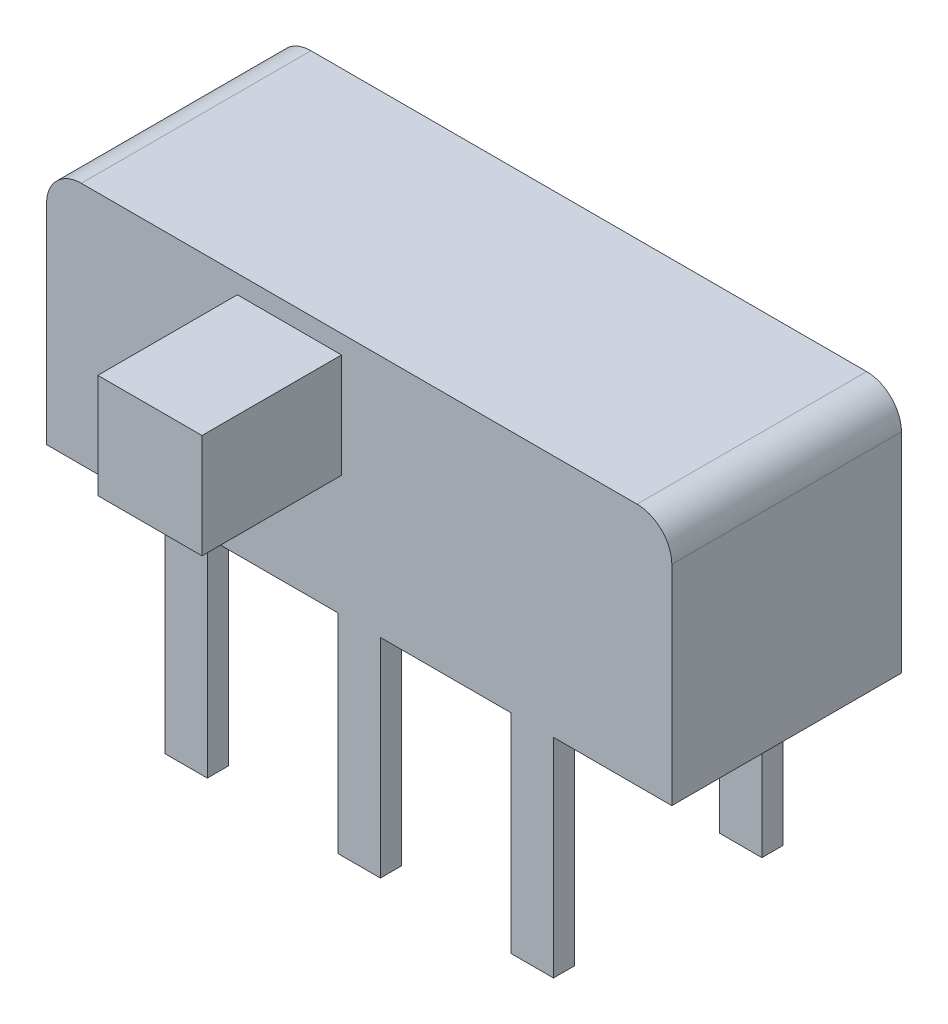
ISO-10303-21;
HEADER;
FILE_DESCRIPTION(('STEP AP214'),'2;1');
FILE_NAME('part.step','',(''),(''),'','','');
FILE_SCHEMA(('AUTOMOTIVE_DESIGN { 1 0 10303 214 1 1 1 1 }'));
ENDSEC;
DATA;
#1=APPLICATION_CONTEXT('core data for automotive mechanical design processes');
#2=APPLICATION_PROTOCOL_DEFINITION('international standard','automotive_design',2000,#1);
#3=PRODUCT_CONTEXT('',#1,'mechanical');
#4=PRODUCT('Part','Part','',(#3));
#5=PRODUCT_RELATED_PRODUCT_CATEGORY('part','',(#4));
#6=PRODUCT_DEFINITION_FORMATION('','',#4);
#7=PRODUCT_DEFINITION_CONTEXT('part definition',#1,'design');
#8=PRODUCT_DEFINITION('design','',#6,#7);
#9=PRODUCT_DEFINITION_SHAPE('','',#8);
#10=(LENGTH_UNIT() NAMED_UNIT(*) SI_UNIT(.MILLI.,.METRE.));
#11=(NAMED_UNIT(*) PLANE_ANGLE_UNIT() SI_UNIT($,.RADIAN.));
#12=(NAMED_UNIT(*) SI_UNIT($,.STERADIAN.) SOLID_ANGLE_UNIT());
#13=UNCERTAINTY_MEASURE_WITH_UNIT(LENGTH_MEASURE(1.E-05),#10,'distance_accuracy_value','');
#14=(GEOMETRIC_REPRESENTATION_CONTEXT(3) GLOBAL_UNCERTAINTY_ASSIGNED_CONTEXT((#13)) GLOBAL_UNIT_ASSIGNED_CONTEXT((#10,
#11,#12)) REPRESENTATION_CONTEXT('',''));
#15=CARTESIAN_POINT('',(0.,0.,0.));
#16=DIRECTION('',(0.,0.,1.));
#17=DIRECTION('',(1.,0.,0.));
#18=AXIS2_PLACEMENT_3D('',#15,#16,#17);
#19=CARTESIAN_POINT('',(-4.4958,0.,-1.65099999999999));
#20=DIRECTION('',(0.,-1.,0.));
#21=DIRECTION('',(0.,0.,-1.));
#22=AXIS2_PLACEMENT_3D('',#19,#20,#21);
#23=PLANE('',#22);
#24=DIRECTION('',(0.,0.,1.));
#25=VECTOR('',#24,1.);
#26=CARTESIAN_POINT('',(-2.794,0.,-1.65099999999999));
#27=LINE('',#26,#25);
#28=CARTESIAN_POINT('',(-2.794,0.,-1.65099999999999));
#29=VERTEX_POINT('',#28);
#30=CARTESIAN_POINT('',(-2.794,0.,-1.34619999999999));
#31=VERTEX_POINT('',#30);
#32=EDGE_CURVE('E50',#29,#31,#27,.T.);
#33=ORIENTED_EDGE('',*,*,#32,.T.);
#34=DIRECTION('',(1.,0.,0.));
#35=VECTOR('',#34,1.);
#36=CARTESIAN_POINT('',(-2.794,0.,-1.34619999999999));
#37=LINE('',#36,#35);
#38=CARTESIAN_POINT('',(-2.1844,0.,-1.34619999999999));
#39=VERTEX_POINT('',#38);
#40=EDGE_CURVE('E271',#31,#39,#37,.T.);
#41=ORIENTED_EDGE('',*,*,#40,.T.);
#42=DIRECTION('',(0.,0.,-1.));
#43=VECTOR('',#42,1.);
#44=CARTESIAN_POINT('',(-2.1844,0.,-1.65099999999999));
#45=LINE('',#44,#43);
#46=CARTESIAN_POINT('',(-2.1844,0.,-1.65099999999999));
#47=VERTEX_POINT('',#46);
#48=EDGE_CURVE('E283',#39,#47,#45,.T.);
#49=ORIENTED_EDGE('',*,*,#48,.T.);
#50=DIRECTION('',(-1.,0.,0.));
#51=VECTOR('',#50,1.);
#52=CARTESIAN_POINT('',(-4.4958,0.,-1.65099999999999));
#53=LINE('',#52,#51);
#54=CARTESIAN_POINT('',(-0.304800000000001,0.,-1.651));
#55=VERTEX_POINT('',#54);
#56=EDGE_CURVE('E483',#55,#47,#53,.T.);
#57=ORIENTED_EDGE('',*,*,#56,.F.);
#58=DIRECTION('',(0.,0.,1.));
#59=VECTOR('',#58,1.);
#60=CARTESIAN_POINT('',(-0.3048,0.,-1.651));
#61=LINE('',#60,#59);
#62=CARTESIAN_POINT('',(-0.3048,0.,-1.3462));
#63=VERTEX_POINT('',#62);
#64=EDGE_CURVE('E58',#55,#63,#61,.T.);
#65=ORIENTED_EDGE('',*,*,#64,.T.);
#66=DIRECTION('',(1.,0.,0.));
#67=VECTOR('',#66,1.);
#68=CARTESIAN_POINT('',(-0.3048,0.,-1.3462));
#69=LINE('',#68,#67);
#70=CARTESIAN_POINT('',(0.3048,0.,-1.3462));
#71=VERTEX_POINT('',#70);
#72=EDGE_CURVE('E296',#63,#71,#69,.T.);
#73=ORIENTED_EDGE('',*,*,#72,.T.);
#74=DIRECTION('',(0.,0.,-1.));
#75=VECTOR('',#74,1.);
#76=CARTESIAN_POINT('',(0.3048,0.,-1.651));
#77=LINE('',#76,#75);
#78=CARTESIAN_POINT('',(0.3048,0.,-1.651));
#79=VERTEX_POINT('',#78);
#80=EDGE_CURVE('E307',#71,#79,#77,.T.);
#81=ORIENTED_EDGE('',*,*,#80,.T.);
#82=CARTESIAN_POINT('',(2.1844,0.,-1.651));
#83=VERTEX_POINT('',#82);
#84=EDGE_CURVE('E477',#83,#79,#53,.T.);
#85=ORIENTED_EDGE('',*,*,#84,.F.);
#86=DIRECTION('',(0.,0.,1.));
#87=VECTOR('',#86,1.);
#88=CARTESIAN_POINT('',(2.1844,0.,-1.65100000000001));
#89=LINE('',#88,#87);
#90=CARTESIAN_POINT('',(2.1844,0.,-1.34620000000001));
#91=VERTEX_POINT('',#90);
#92=EDGE_CURVE('E319',#83,#91,#89,.T.);
#93=ORIENTED_EDGE('',*,*,#92,.T.);
#94=DIRECTION('',(1.,0.,0.));
#95=VECTOR('',#94,1.);
#96=CARTESIAN_POINT('',(2.1844,0.,-1.34620000000001));
#97=LINE('',#96,#95);
#98=CARTESIAN_POINT('',(2.794,0.,-1.34620000000001));
#99=VERTEX_POINT('',#98);
#100=EDGE_CURVE('E324',#91,#99,#97,.T.);
#101=ORIENTED_EDGE('',*,*,#100,.T.);
#102=DIRECTION('',(0.,0.,-1.));
#103=VECTOR('',#102,1.);
#104=CARTESIAN_POINT('',(2.794,0.,-1.65100000000001));
#105=LINE('',#104,#103);
#106=CARTESIAN_POINT('',(2.794,0.,-1.65100000000001));
#107=VERTEX_POINT('',#106);
#108=EDGE_CURVE('E336',#99,#107,#105,.T.);
#109=ORIENTED_EDGE('',*,*,#108,.T.);
#110=CARTESIAN_POINT('',(4.4958,0.,-1.651));
#111=VERTEX_POINT('',#110);
#112=EDGE_CURVE('E474',#111,#107,#53,.T.);
#113=ORIENTED_EDGE('',*,*,#112,.F.);
#114=DIRECTION('',(0.,0.,-1.));
#115=VECTOR('',#114,1.);
#116=CARTESIAN_POINT('',(4.4958,0.,1.651));
#117=LINE('',#116,#115);
#118=CARTESIAN_POINT('',(4.4958,0.,1.651));
#119=VERTEX_POINT('',#118);
#120=EDGE_CURVE('E438',#119,#111,#117,.T.);
#121=ORIENTED_EDGE('',*,*,#120,.F.);
#122=DIRECTION('',(1.,0.,0.));
#123=VECTOR('',#122,1.);
#124=CARTESIAN_POINT('',(-4.4958,0.,1.65100000000001));
#125=LINE('',#124,#123);
#126=CARTESIAN_POINT('',(2.794,0.,1.651));
#127=VERTEX_POINT('',#126);
#128=EDGE_CURVE('E432',#127,#119,#125,.T.);
#129=ORIENTED_EDGE('',*,*,#128,.F.);
#130=DIRECTION('',(0.,0.,1.));
#131=VECTOR('',#130,1.);
#132=CARTESIAN_POINT('',(2.794,0.,1.65100000000001));
#133=LINE('',#132,#131);
#134=CARTESIAN_POINT('',(2.794,0.,1.34620000000001));
#135=VERTEX_POINT('',#134);
#136=EDGE_CURVE('E407',#135,#127,#133,.T.);
#137=ORIENTED_EDGE('',*,*,#136,.F.);
#138=DIRECTION('',(1.,0.,0.));
#139=VECTOR('',#138,1.);
#140=CARTESIAN_POINT('',(2.1844,0.,1.34620000000001));
#141=LINE('',#140,#139);
#142=CARTESIAN_POINT('',(2.1844,0.,1.34620000000001));
#143=VERTEX_POINT('',#142);
#144=EDGE_CURVE('E414',#143,#135,#141,.T.);
#145=ORIENTED_EDGE('',*,*,#144,.F.);
#146=DIRECTION('',(0.,0.,-1.));
#147=VECTOR('',#146,1.);
#148=CARTESIAN_POINT('',(2.1844,0.,1.65100000000001));
#149=LINE('',#148,#147);
#150=CARTESIAN_POINT('',(2.1844,0.,1.651));
#151=VERTEX_POINT('',#150);
#152=EDGE_CURVE('E402',#151,#143,#149,.T.);
#153=ORIENTED_EDGE('',*,*,#152,.F.);
#154=CARTESIAN_POINT('',(0.3048,0.,1.65100000000001));
#155=VERTEX_POINT('',#154);
#156=EDGE_CURVE('E431',#155,#151,#125,.T.);
#157=ORIENTED_EDGE('',*,*,#156,.F.);
#158=DIRECTION('',(0.,0.,1.));
#159=VECTOR('',#158,1.);
#160=CARTESIAN_POINT('',(0.3048,0.,1.65100000000002));
#161=LINE('',#160,#159);
#162=CARTESIAN_POINT('',(0.3048,0.,1.34620000000002));
#163=VERTEX_POINT('',#162);
#164=EDGE_CURVE('E380',#163,#155,#161,.T.);
#165=ORIENTED_EDGE('',*,*,#164,.F.);
#166=DIRECTION('',(1.,0.,0.));
#167=VECTOR('',#166,1.);
#168=CARTESIAN_POINT('',(-0.3048,0.,1.34620000000002));
#169=LINE('',#168,#167);
#170=CARTESIAN_POINT('',(-0.3048,0.,1.34620000000002));
#171=VERTEX_POINT('',#170);
#172=EDGE_CURVE('E389',#171,#163,#169,.T.);
#173=ORIENTED_EDGE('',*,*,#172,.F.);
#174=DIRECTION('',(0.,0.,-1.));
#175=VECTOR('',#174,1.);
#176=CARTESIAN_POINT('',(-0.3048,0.,1.65100000000002));
#177=LINE('',#176,#175);
#178=CARTESIAN_POINT('',(-0.3048,0.,1.65100000000002));
#179=VERTEX_POINT('',#178);
#180=EDGE_CURVE('E375',#179,#171,#177,.T.);
#181=ORIENTED_EDGE('',*,*,#180,.F.);
#182=CARTESIAN_POINT('',(-2.1844,0.,1.65100000000001));
#183=VERTEX_POINT('',#182);
#184=EDGE_CURVE('E36',#183,#179,#125,.T.);
#185=ORIENTED_EDGE('',*,*,#184,.F.);
#186=DIRECTION('',(0.,0.,1.));
#187=VECTOR('',#186,1.);
#188=CARTESIAN_POINT('',(-2.1844,0.,1.65100000000002));
#189=LINE('',#188,#187);
#190=CARTESIAN_POINT('',(-2.1844,0.,1.34620000000002));
#191=VERTEX_POINT('',#190);
#192=EDGE_CURVE('E354',#191,#183,#189,.T.);
#193=ORIENTED_EDGE('',*,*,#192,.F.);
#194=DIRECTION('',(1.,0.,0.));
#195=VECTOR('',#194,1.);
#196=CARTESIAN_POINT('',(-2.794,0.,1.34620000000002));
#197=LINE('',#196,#195);
#198=CARTESIAN_POINT('',(-2.794,0.,1.34620000000002));
#199=VERTEX_POINT('',#198);
#200=EDGE_CURVE('E363',#199,#191,#197,.T.);
#201=ORIENTED_EDGE('',*,*,#200,.F.);
#202=DIRECTION('',(0.,0.,-1.));
#203=VECTOR('',#202,1.);
#204=CARTESIAN_POINT('',(-2.794,0.,1.65100000000002));
#205=LINE('',#204,#203);
#206=CARTESIAN_POINT('',(-2.794,0.,1.65100000000002));
#207=VERTEX_POINT('',#206);
#208=EDGE_CURVE('E349',#207,#199,#205,.T.);
#209=ORIENTED_EDGE('',*,*,#208,.F.);
#210=CARTESIAN_POINT('',(-4.4958,0.,1.65100000000001));
#211=VERTEX_POINT('',#210);
#212=EDGE_CURVE('E446',#211,#207,#125,.T.);
#213=ORIENTED_EDGE('',*,*,#212,.F.);
#214=DIRECTION('',(0.,0.,1.));
#215=VECTOR('',#214,1.);
#216=CARTESIAN_POINT('',(-4.4958,0.,1.65100000000001));
#217=LINE('',#216,#215);
#218=CARTESIAN_POINT('',(-4.4958,0.,-1.65099999999999));
#219=VERTEX_POINT('',#218);
#220=EDGE_CURVE('E436',#219,#211,#217,.T.);
#221=ORIENTED_EDGE('',*,*,#220,.F.);
#222=EDGE_CURVE('E478',#29,#219,#53,.T.);
#223=ORIENTED_EDGE('',*,*,#222,.F.);
#224=EDGE_LOOP('',(#33,#41,#49,#57,#65,#73,#81,#85,#93,#101,#109,#113,#121,#129,#137,#145,#153,
#157,#165,#173,#181,#185,#193,#201,#209,#213,#221,#223));
#225=FACE_BOUND('',#224,.T.);
#226=ADVANCED_FACE('F32',(#225),#23,.T.);
#227=CARTESIAN_POINT('',(-4.4958,3.5052,1.65100000000001));
#228=DIRECTION('',(0.,0.,-1.));
#229=DIRECTION('',(-1.,0.,0.));
#230=AXIS2_PLACEMENT_3D('',#227,#228,#229);
#231=PLANE('',#230);
#232=DIRECTION('',(0.,-1.,0.));
#233=VECTOR('',#232,1.);
#234=CARTESIAN_POINT('',(4.4958,3.5052,1.651));
#235=LINE('',#234,#233);
#236=CARTESIAN_POINT('',(4.4958,3.0052,1.651));
#237=VERTEX_POINT('',#236);
#238=EDGE_CURVE('E466',#237,#119,#235,.T.);
#239=ORIENTED_EDGE('',*,*,#238,.F.);
#240=CARTESIAN_POINT('',(3.9958,3.0052,1.651));
#241=DIRECTION('',(0.,0.,-1.));
#242=DIRECTION('',(-1.,0.,0.));
#243=AXIS2_PLACEMENT_3D('',#240,#241,#242);
#244=CIRCLE('',#243,0.5);
#245=CARTESIAN_POINT('',(3.9958,3.5052,1.651));
#246=VERTEX_POINT('',#245);
#247=EDGE_CURVE('E42',#237,#246,#244,.F.);
#248=ORIENTED_EDGE('',*,*,#247,.T.);
#249=DIRECTION('',(1.,0.,0.));
#250=VECTOR('',#249,1.);
#251=CARTESIAN_POINT('',(-4.4958,3.5052,1.65100000000001));
#252=LINE('',#251,#250);
#253=CARTESIAN_POINT('',(-3.9958,3.5052,1.65100000000001));
#254=VERTEX_POINT('',#253);
#255=EDGE_CURVE('E476',#254,#246,#252,.T.);
#256=ORIENTED_EDGE('',*,*,#255,.F.);
#257=CARTESIAN_POINT('',(-3.9958,3.0052,1.65100000000001));
#258=DIRECTION('',(0.,0.,-1.));
#259=DIRECTION('',(-1.,0.,0.));
#260=AXIS2_PLACEMENT_3D('',#257,#258,#259);
#261=CIRCLE('',#260,0.5);
#262=CARTESIAN_POINT('',(-4.4958,3.0052,1.65100000000001));
#263=VERTEX_POINT('',#262);
#264=EDGE_CURVE('E450',#254,#263,#261,.F.);
#265=ORIENTED_EDGE('',*,*,#264,.T.);
#266=DIRECTION('',(0.,-1.,0.));
#267=VECTOR('',#266,1.);
#268=CARTESIAN_POINT('',(-4.4958,3.5052,1.65100000000001));
#269=LINE('',#268,#267);
#270=EDGE_CURVE('E464',#263,#211,#269,.T.);
#271=ORIENTED_EDGE('',*,*,#270,.T.);
#272=ORIENTED_EDGE('',*,*,#212,.T.);
#273=DIRECTION('',(0.,1.,0.));
#274=VECTOR('',#273,1.);
#275=CARTESIAN_POINT('',(-2.794,-2.9972,1.65100000000002));
#276=LINE('',#275,#274);
#277=CARTESIAN_POINT('',(-2.794,-2.9972,1.65100000000002));
#278=VERTEX_POINT('',#277);
#279=EDGE_CURVE('E360',#278,#207,#276,.T.);
#280=ORIENTED_EDGE('',*,*,#279,.F.);
#281=DIRECTION('',(-1.,0.,0.));
#282=VECTOR('',#281,1.);
#283=CARTESIAN_POINT('',(-2.794,-2.9972,1.65100000000002));
#284=LINE('',#283,#282);
#285=CARTESIAN_POINT('',(-2.1844,-2.9972,1.65100000000002));
#286=VERTEX_POINT('',#285);
#287=EDGE_CURVE('E358',#286,#278,#284,.T.);
#288=ORIENTED_EDGE('',*,*,#287,.F.);
#289=DIRECTION('',(0.,1.,0.));
#290=VECTOR('',#289,1.);
#291=CARTESIAN_POINT('',(-2.1844,-2.9972,1.65100000000002));
#292=LINE('',#291,#290);
#293=EDGE_CURVE('E368',#286,#183,#292,.T.);
#294=ORIENTED_EDGE('',*,*,#293,.T.);
#295=ORIENTED_EDGE('',*,*,#184,.T.);
#296=DIRECTION('',(0.,1.,0.));
#297=VECTOR('',#296,1.);
#298=CARTESIAN_POINT('',(-0.3048,-2.9972,1.65100000000002));
#299=LINE('',#298,#297);
#300=CARTESIAN_POINT('',(-0.3048,-2.9972,1.65100000000002));
#301=VERTEX_POINT('',#300);
#302=EDGE_CURVE('E386',#301,#179,#299,.T.);
#303=ORIENTED_EDGE('',*,*,#302,.F.);
#304=DIRECTION('',(-1.,0.,0.));
#305=VECTOR('',#304,1.);
#306=CARTESIAN_POINT('',(-0.3048,-2.9972,1.65100000000002));
#307=LINE('',#306,#305);
#308=CARTESIAN_POINT('',(0.3048,-2.9972,1.65100000000002));
#309=VERTEX_POINT('',#308);
#310=EDGE_CURVE('E384',#309,#301,#307,.T.);
#311=ORIENTED_EDGE('',*,*,#310,.F.);
#312=DIRECTION('',(0.,1.,0.));
#313=VECTOR('',#312,1.);
#314=CARTESIAN_POINT('',(0.3048,-2.9972,1.65100000000002));
#315=LINE('',#314,#313);
#316=EDGE_CURVE('E395',#309,#155,#315,.T.);
#317=ORIENTED_EDGE('',*,*,#316,.T.);
#318=ORIENTED_EDGE('',*,*,#156,.T.);
#319=DIRECTION('',(0.,1.,0.));
#320=VECTOR('',#319,1.);
#321=CARTESIAN_POINT('',(2.1844,-2.9972,1.65100000000001));
#322=LINE('',#321,#320);
#323=CARTESIAN_POINT('',(2.1844,-2.9972,1.65100000000001));
#324=VERTEX_POINT('',#323);
#325=EDGE_CURVE('E413',#324,#151,#322,.T.);
#326=ORIENTED_EDGE('',*,*,#325,.F.);
#327=DIRECTION('',(-1.,0.,0.));
#328=VECTOR('',#327,1.);
#329=CARTESIAN_POINT('',(2.1844,-2.9972,1.65100000000001));
#330=LINE('',#329,#328);
#331=CARTESIAN_POINT('',(2.794,-2.9972,1.65100000000001));
#332=VERTEX_POINT('',#331);
#333=EDGE_CURVE('E411',#332,#324,#330,.T.);
#334=ORIENTED_EDGE('',*,*,#333,.F.);
#335=DIRECTION('',(0.,1.,0.));
#336=VECTOR('',#335,1.);
#337=CARTESIAN_POINT('',(2.794,-2.9972,1.65100000000001));
#338=LINE('',#337,#336);
#339=EDGE_CURVE('E427',#332,#127,#338,.T.);
#340=ORIENTED_EDGE('',*,*,#339,.T.);
#341=ORIENTED_EDGE('',*,*,#128,.T.);
#342=EDGE_LOOP('',(#239,#248,#256,#265,#271,#272,#280,#288,#294,#295,#303,#311,#317,#318,#326,
#334,#340,#341));
#343=FACE_BOUND('',#342,.T.);
#344=DIRECTION('',(-1.,0.,0.));
#345=VECTOR('',#344,1.);
#346=CARTESIAN_POINT('',(-1.7526,3.2385,1.65100000000001));
#347=LINE('',#346,#345);
#348=CARTESIAN_POINT('',(-0.253999999999998,3.2385,1.65100000000001));
#349=VERTEX_POINT('',#348);
#350=CARTESIAN_POINT('',(-1.7526,3.2385,1.65100000000001));
#351=VERTEX_POINT('',#350);
#352=EDGE_CURVE('E912',#349,#351,#347,.T.);
#353=ORIENTED_EDGE('',*,*,#352,.F.);
#354=DIRECTION('',(0.,1.,0.));
#355=VECTOR('',#354,1.);
#356=CARTESIAN_POINT('',(-0.253999999999998,1.7399,1.65100000000001));
#357=LINE('',#356,#355);
#358=CARTESIAN_POINT('',(-0.253999999999998,1.7399,1.65100000000001));
#359=VERTEX_POINT('',#358);
#360=EDGE_CURVE('E922',#359,#349,#357,.T.);
#361=ORIENTED_EDGE('',*,*,#360,.F.);
#362=DIRECTION('',(1.,0.,0.));
#363=VECTOR('',#362,1.);
#364=CARTESIAN_POINT('',(-1.7526,1.7399,1.65100000000001));
#365=LINE('',#364,#363);
#366=CARTESIAN_POINT('',(-1.7526,1.7399,1.65100000000001));
#367=VERTEX_POINT('',#366);
#368=EDGE_CURVE('E930',#367,#359,#365,.T.);
#369=ORIENTED_EDGE('',*,*,#368,.F.);
#370=DIRECTION('',(0.,-1.,0.));
#371=VECTOR('',#370,1.);
#372=CARTESIAN_POINT('',(-1.7526,1.7399,1.65100000000001));
#373=LINE('',#372,#371);
#374=EDGE_CURVE('E915',#351,#367,#373,.T.);
#375=ORIENTED_EDGE('',*,*,#374,.F.);
#376=EDGE_LOOP('',(#353,#361,#369,#375));
#377=FACE_BOUND('',#376,.T.);
#378=ADVANCED_FACE('F552',(#343,#377),#231,.F.);
#379=CARTESIAN_POINT('',(-4.4958,3.5052,1.65100000000001));
#380=DIRECTION('',(1.,0.,0.));
#381=DIRECTION('',(0.,0.,-1.));
#382=AXIS2_PLACEMENT_3D('',#379,#380,#381);
#383=PLANE('',#382);
#384=ORIENTED_EDGE('',*,*,#270,.F.);
#385=DIRECTION('',(0.,0.,1.));
#386=VECTOR('',#385,1.);
#387=CARTESIAN_POINT('',(-4.4958,3.0052,1.65100000000001));
#388=LINE('',#387,#386);
#389=CARTESIAN_POINT('',(-4.4958,3.0052,-1.65099999999999));
#390=VERTEX_POINT('',#389);
#391=EDGE_CURVE('E11',#263,#390,#388,.F.);
#392=ORIENTED_EDGE('',*,*,#391,.T.);
#393=DIRECTION('',(0.,-1.,0.));
#394=VECTOR('',#393,1.);
#395=CARTESIAN_POINT('',(-4.4958,3.5052,-1.65099999999999));
#396=LINE('',#395,#394);
#397=EDGE_CURVE('E471',#390,#219,#396,.T.);
#398=ORIENTED_EDGE('',*,*,#397,.T.);
#399=ORIENTED_EDGE('',*,*,#220,.T.);
#400=EDGE_LOOP('',(#384,#392,#398,#399));
#401=FACE_BOUND('',#400,.T.);
#402=ADVANCED_FACE('F554',(#401),#383,.F.);
#403=CARTESIAN_POINT('',(4.4958,3.5052,1.651));
#404=DIRECTION('',(-1.,0.,0.));
#405=DIRECTION('',(0.,0.,1.));
#406=AXIS2_PLACEMENT_3D('',#403,#404,#405);
#407=PLANE('',#406);
#408=DIRECTION('',(0.,-1.,0.));
#409=VECTOR('',#408,1.);
#410=CARTESIAN_POINT('',(4.4958,3.5052,-1.651));
#411=LINE('',#410,#409);
#412=CARTESIAN_POINT('',(4.4958,3.0052,-1.651));
#413=VERTEX_POINT('',#412);
#414=EDGE_CURVE('E469',#413,#111,#411,.T.);
#415=ORIENTED_EDGE('',*,*,#414,.F.);
#416=DIRECTION('',(0.,0.,-1.));
#417=VECTOR('',#416,1.);
#418=CARTESIAN_POINT('',(4.4958,3.0052,1.651));
#419=LINE('',#418,#417);
#420=EDGE_CURVE('E452',#413,#237,#419,.F.);
#421=ORIENTED_EDGE('',*,*,#420,.T.);
#422=ORIENTED_EDGE('',*,*,#238,.T.);
#423=ORIENTED_EDGE('',*,*,#120,.T.);
#424=EDGE_LOOP('',(#415,#421,#422,#423));
#425=FACE_BOUND('',#424,.T.);
#426=ADVANCED_FACE('F489',(#425),#407,.F.);
#427=CARTESIAN_POINT('',(-4.4958,3.5052,-1.65099999999999));
#428=DIRECTION('',(0.,0.,1.));
#429=DIRECTION('',(1.,0.,0.));
#430=AXIS2_PLACEMENT_3D('',#427,#428,#429);
#431=PLANE('',#430);
#432=DIRECTION('',(-1.,0.,0.));
#433=VECTOR('',#432,1.);
#434=CARTESIAN_POINT('',(-4.4958,3.5052,-1.65099999999999));
#435=LINE('',#434,#433);
#436=CARTESIAN_POINT('',(3.9958,3.5052,-1.651));
#437=VERTEX_POINT('',#436);
#438=CARTESIAN_POINT('',(-3.9958,3.5052,-1.65099999999999));
#439=VERTEX_POINT('',#438);
#440=EDGE_CURVE('E473',#437,#439,#435,.T.);
#441=ORIENTED_EDGE('',*,*,#440,.F.);
#442=CARTESIAN_POINT('',(3.9958,3.0052,-1.651));
#443=DIRECTION('',(0.,0.,1.));
#444=DIRECTION('',(1.,0.,0.));
#445=AXIS2_PLACEMENT_3D('',#442,#443,#444);
#446=CIRCLE('',#445,0.5);
#447=EDGE_CURVE('E454',#437,#413,#446,.F.);
#448=ORIENTED_EDGE('',*,*,#447,.T.);
#449=ORIENTED_EDGE('',*,*,#414,.T.);
#450=ORIENTED_EDGE('',*,*,#112,.T.);
#451=DIRECTION('',(0.,1.,0.));
#452=VECTOR('',#451,1.);
#453=CARTESIAN_POINT('',(2.794,-2.9972,-1.65100000000001));
#454=LINE('',#453,#452);
#455=CARTESIAN_POINT('',(2.794,-2.9972,-1.65100000000001));
#456=VERTEX_POINT('',#455);
#457=EDGE_CURVE('E344',#456,#107,#454,.T.);
#458=ORIENTED_EDGE('',*,*,#457,.F.);
#459=DIRECTION('',(-1.,0.,0.));
#460=VECTOR('',#459,1.);
#461=CARTESIAN_POINT('',(2.1844,-2.9972,-1.65100000000001));
#462=LINE('',#461,#460);
#463=CARTESIAN_POINT('',(2.1844,-2.9972,-1.65100000000001));
#464=VERTEX_POINT('',#463);
#465=EDGE_CURVE('E323',#456,#464,#462,.T.);
#466=ORIENTED_EDGE('',*,*,#465,.T.);
#467=DIRECTION('',(0.,1.,0.));
#468=VECTOR('',#467,1.);
#469=CARTESIAN_POINT('',(2.1844,-2.9972,-1.65100000000001));
#470=LINE('',#469,#468);
#471=EDGE_CURVE('E346',#464,#83,#470,.T.);
#472=ORIENTED_EDGE('',*,*,#471,.T.);
#473=ORIENTED_EDGE('',*,*,#84,.T.);
#474=DIRECTION('',(0.,1.,0.));
#475=VECTOR('',#474,1.);
#476=CARTESIAN_POINT('',(0.3048,-2.9972,-1.651));
#477=LINE('',#476,#475);
#478=CARTESIAN_POINT('',(0.3048,-2.9972,-1.651));
#479=VERTEX_POINT('',#478);
#480=EDGE_CURVE('E315',#479,#79,#477,.T.);
#481=ORIENTED_EDGE('',*,*,#480,.F.);
#482=DIRECTION('',(-1.,0.,0.));
#483=VECTOR('',#482,1.);
#484=CARTESIAN_POINT('',(-0.3048,-2.9972,-1.651));
#485=LINE('',#484,#483);
#486=CARTESIAN_POINT('',(-0.3048,-2.9972,-1.651));
#487=VERTEX_POINT('',#486);
#488=EDGE_CURVE('E295',#479,#487,#485,.T.);
#489=ORIENTED_EDGE('',*,*,#488,.T.);
#490=DIRECTION('',(0.,1.,0.));
#491=VECTOR('',#490,1.);
#492=CARTESIAN_POINT('',(-0.3048,-2.9972,-1.651));
#493=LINE('',#492,#491);
#494=EDGE_CURVE('E317',#487,#55,#493,.T.);
#495=ORIENTED_EDGE('',*,*,#494,.T.);
#496=ORIENTED_EDGE('',*,*,#56,.T.);
#497=DIRECTION('',(0.,1.,0.));
#498=VECTOR('',#497,1.);
#499=CARTESIAN_POINT('',(-2.1844,-2.9972,-1.65099999999999));
#500=LINE('',#499,#498);
#501=CARTESIAN_POINT('',(-2.1844,-2.9972,-1.65099999999999));
#502=VERTEX_POINT('',#501);
#503=EDGE_CURVE('E261',#502,#47,#500,.T.);
#504=ORIENTED_EDGE('',*,*,#503,.F.);
#505=DIRECTION('',(-1.,0.,0.));
#506=VECTOR('',#505,1.);
#507=CARTESIAN_POINT('',(-2.794,-2.9972,-1.65099999999999));
#508=LINE('',#507,#506);
#509=CARTESIAN_POINT('',(-2.794,-2.9972,-1.65099999999999));
#510=VERTEX_POINT('',#509);
#511=EDGE_CURVE('E267',#502,#510,#508,.T.);
#512=ORIENTED_EDGE('',*,*,#511,.T.);
#513=DIRECTION('',(0.,1.,0.));
#514=VECTOR('',#513,1.);
#515=CARTESIAN_POINT('',(-2.794,-2.9972,-1.65099999999999));
#516=LINE('',#515,#514);
#517=EDGE_CURVE('E253',#510,#29,#516,.T.);
#518=ORIENTED_EDGE('',*,*,#517,.T.);
#519=ORIENTED_EDGE('',*,*,#222,.T.);
#520=ORIENTED_EDGE('',*,*,#397,.F.);
#521=CARTESIAN_POINT('',(-3.9958,3.0052,-1.65099999999999));
#522=DIRECTION('',(0.,0.,1.));
#523=DIRECTION('',(1.,0.,0.));
#524=AXIS2_PLACEMENT_3D('',#521,#522,#523);
#525=CIRCLE('',#524,0.5);
#526=EDGE_CURVE('E456',#390,#439,#525,.F.);
#527=ORIENTED_EDGE('',*,*,#526,.T.);
#528=EDGE_LOOP('',(#441,#448,#449,#450,#458,#466,#472,#473,#481,#489,#495,#496,#504,#512,#518,
#519,#520,#527));
#529=FACE_BOUND('',#528,.T.);
#530=ADVANCED_FACE('F274',(#529),#431,.F.);
#531=CARTESIAN_POINT('',(-4.4958,3.5052,-1.65099999999999));
#532=DIRECTION('',(0.,-1.,0.));
#533=DIRECTION('',(0.,0.,-1.));
#534=AXIS2_PLACEMENT_3D('',#531,#532,#533);
#535=PLANE('',#534);
#536=ORIENTED_EDGE('',*,*,#255,.T.);
#537=DIRECTION('',(0.,0.,-1.));
#538=VECTOR('',#537,1.);
#539=CARTESIAN_POINT('',(3.9958,3.5052,-1.65099999999999));
#540=LINE('',#539,#538);
#541=EDGE_CURVE('E458',#246,#437,#540,.T.);
#542=ORIENTED_EDGE('',*,*,#541,.T.);
#543=ORIENTED_EDGE('',*,*,#440,.T.);
#544=DIRECTION('',(0.,0.,1.));
#545=VECTOR('',#544,1.);
#546=CARTESIAN_POINT('',(-3.9958,3.5052,-1.65099999999999));
#547=LINE('',#546,#545);
#548=EDGE_CURVE('E461',#439,#254,#547,.T.);
#549=ORIENTED_EDGE('',*,*,#548,.T.);
#550=EDGE_LOOP('',(#536,#542,#543,#549));
#551=FACE_BOUND('',#550,.T.);
#552=ADVANCED_FACE('F545',(#551),#535,.F.);
#553=CARTESIAN_POINT('',(-1.7526,3.2385,3.65760000000001));
#554=DIRECTION('',(0.,-1.,0.));
#555=DIRECTION('',(0.,0.,-1.));
#556=AXIS2_PLACEMENT_3D('',#553,#554,#555);
#557=PLANE('',#556);
#558=ORIENTED_EDGE('',*,*,#352,.T.);
#559=DIRECTION('',(0.,0.,-1.));
#560=VECTOR('',#559,1.);
#561=CARTESIAN_POINT('',(-1.7526,3.2385,3.65760000000001));
#562=LINE('',#561,#560);
#563=CARTESIAN_POINT('',(-1.7526,3.2385,3.65760000000001));
#564=VERTEX_POINT('',#563);
#565=EDGE_CURVE('E530',#564,#351,#562,.T.);
#566=ORIENTED_EDGE('',*,*,#565,.F.);
#567=DIRECTION('',(-1.,0.,0.));
#568=VECTOR('',#567,1.);
#569=CARTESIAN_POINT('',(-1.7526,3.2385,3.65760000000001));
#570=LINE('',#569,#568);
#571=CARTESIAN_POINT('',(-0.253999999999998,3.2385,3.65760000000001));
#572=VERTEX_POINT('',#571);
#573=EDGE_CURVE('E918',#572,#564,#570,.T.);
#574=ORIENTED_EDGE('',*,*,#573,.F.);
#575=DIRECTION('',(0.,0.,-1.));
#576=VECTOR('',#575,1.);
#577=CARTESIAN_POINT('',(-0.253999999999998,3.2385,3.65760000000001));
#578=LINE('',#577,#576);
#579=EDGE_CURVE('E927',#572,#349,#578,.T.);
#580=ORIENTED_EDGE('',*,*,#579,.T.);
#581=EDGE_LOOP('',(#558,#566,#574,#580));
#582=FACE_BOUND('',#581,.T.);
#583=ADVANCED_FACE('F574',(#582),#557,.F.);
#584=CARTESIAN_POINT('',(-1.7526,1.7399,3.65760000000001));
#585=DIRECTION('',(1.,0.,0.));
#586=DIRECTION('',(0.,1.,0.));
#587=AXIS2_PLACEMENT_3D('',#584,#585,#586);
#588=PLANE('',#587);
#589=ORIENTED_EDGE('',*,*,#374,.T.);
#590=DIRECTION('',(0.,0.,-1.));
#591=VECTOR('',#590,1.);
#592=CARTESIAN_POINT('',(-1.7526,1.7399,3.65760000000001));
#593=LINE('',#592,#591);
#594=CARTESIAN_POINT('',(-1.7526,1.7399,3.65760000000001));
#595=VERTEX_POINT('',#594);
#596=EDGE_CURVE('E532',#595,#367,#593,.T.);
#597=ORIENTED_EDGE('',*,*,#596,.F.);
#598=DIRECTION('',(0.,-1.,0.));
#599=VECTOR('',#598,1.);
#600=CARTESIAN_POINT('',(-1.7526,1.7399,3.65760000000001));
#601=LINE('',#600,#599);
#602=EDGE_CURVE('E921',#564,#595,#601,.T.);
#603=ORIENTED_EDGE('',*,*,#602,.F.);
#604=ORIENTED_EDGE('',*,*,#565,.T.);
#605=EDGE_LOOP('',(#589,#597,#603,#604));
#606=FACE_BOUND('',#605,.T.);
#607=ADVANCED_FACE('F578',(#606),#588,.F.);
#608=CARTESIAN_POINT('',(-1.7526,1.7399,3.65760000000001));
#609=DIRECTION('',(0.,1.,0.));
#610=DIRECTION('',(0.,0.,1.));
#611=AXIS2_PLACEMENT_3D('',#608,#609,#610);
#612=PLANE('',#611);
#613=ORIENTED_EDGE('',*,*,#368,.T.);
#614=DIRECTION('',(0.,0.,-1.));
#615=VECTOR('',#614,1.);
#616=CARTESIAN_POINT('',(-0.253999999999998,1.7399,3.65760000000001));
#617=LINE('',#616,#615);
#618=CARTESIAN_POINT('',(-0.253999999999998,1.7399,3.65760000000001));
#619=VERTEX_POINT('',#618);
#620=EDGE_CURVE('E539',#619,#359,#617,.T.);
#621=ORIENTED_EDGE('',*,*,#620,.F.);
#622=DIRECTION('',(1.,0.,0.));
#623=VECTOR('',#622,1.);
#624=CARTESIAN_POINT('',(-1.7526,1.7399,3.65760000000001));
#625=LINE('',#624,#623);
#626=EDGE_CURVE('E924',#595,#619,#625,.T.);
#627=ORIENTED_EDGE('',*,*,#626,.F.);
#628=ORIENTED_EDGE('',*,*,#596,.T.);
#629=EDGE_LOOP('',(#613,#621,#627,#628));
#630=FACE_BOUND('',#629,.T.);
#631=ADVANCED_FACE('F583',(#630),#612,.F.);
#632=CARTESIAN_POINT('',(-0.253999999999998,1.7399,3.65760000000001));
#633=DIRECTION('',(-1.,0.,0.));
#634=DIRECTION('',(0.,-1.,0.));
#635=AXIS2_PLACEMENT_3D('',#632,#633,#634);
#636=PLANE('',#635);
#637=ORIENTED_EDGE('',*,*,#360,.T.);
#638=ORIENTED_EDGE('',*,*,#579,.F.);
#639=DIRECTION('',(0.,1.,0.));
#640=VECTOR('',#639,1.);
#641=CARTESIAN_POINT('',(-0.253999999999998,1.7399,3.65760000000001));
#642=LINE('',#641,#640);
#643=EDGE_CURVE('E926',#619,#572,#642,.T.);
#644=ORIENTED_EDGE('',*,*,#643,.F.);
#645=ORIENTED_EDGE('',*,*,#620,.T.);
#646=EDGE_LOOP('',(#637,#638,#644,#645));
#647=FACE_BOUND('',#646,.T.);
#648=ADVANCED_FACE('F588',(#647),#636,.F.);
#649=CARTESIAN_POINT('',(-0.253999999999998,3.2385,3.65760000000001));
#650=DIRECTION('',(0.,0.,1.));
#651=DIRECTION('',(1.,0.,0.));
#652=AXIS2_PLACEMENT_3D('',#649,#650,#651);
#653=PLANE('',#652);
#654=ORIENTED_EDGE('',*,*,#573,.T.);
#655=ORIENTED_EDGE('',*,*,#602,.T.);
#656=ORIENTED_EDGE('',*,*,#626,.T.);
#657=ORIENTED_EDGE('',*,*,#643,.T.);
#658=EDGE_LOOP('',(#654,#655,#656,#657));
#659=FACE_BOUND('',#658,.T.);
#660=ADVANCED_FACE('F592',(#659),#653,.T.);
#661=CARTESIAN_POINT('',(3.9958,3.0052,-1.65099999999999));
#662=DIRECTION('',(0.,0.,-1.));
#663=DIRECTION('',(-1.,0.,0.));
#664=AXIS2_PLACEMENT_3D('',#661,#662,#663);
#665=CYLINDRICAL_SURFACE('',#664,0.5);
#666=ORIENTED_EDGE('',*,*,#247,.F.);
#667=ORIENTED_EDGE('',*,*,#420,.F.);
#668=ORIENTED_EDGE('',*,*,#447,.F.);
#669=ORIENTED_EDGE('',*,*,#541,.F.);
#670=EDGE_LOOP('',(#666,#667,#668,#669));
#671=FACE_BOUND('',#670,.T.);
#672=ADVANCED_FACE('F596',(#671),#665,.T.);
#673=CARTESIAN_POINT('',(-3.9958,3.0052,-1.65099999999999));
#674=DIRECTION('',(0.,0.,1.));
#675=DIRECTION('',(1.,0.,0.));
#676=AXIS2_PLACEMENT_3D('',#673,#674,#675);
#677=CYLINDRICAL_SURFACE('',#676,0.5);
#678=ORIENTED_EDGE('',*,*,#526,.F.);
#679=ORIENTED_EDGE('',*,*,#391,.F.);
#680=ORIENTED_EDGE('',*,*,#264,.F.);
#681=ORIENTED_EDGE('',*,*,#548,.F.);
#682=EDGE_LOOP('',(#678,#679,#680,#681));
#683=FACE_BOUND('',#682,.T.);
#684=ADVANCED_FACE('F34',(#683),#677,.T.);
#685=CARTESIAN_POINT('',(2.1844,-2.9972,1.65100000000001));
#686=DIRECTION('',(1.,0.,0.));
#687=DIRECTION('',(0.,0.,-1.));
#688=AXIS2_PLACEMENT_3D('',#685,#686,#687);
#689=PLANE('',#688);
#690=ORIENTED_EDGE('',*,*,#152,.T.);
#691=DIRECTION('',(0.,1.,0.));
#692=VECTOR('',#691,1.);
#693=CARTESIAN_POINT('',(2.1844,-2.9972,1.34620000000001));
#694=LINE('',#693,#692);
#695=CARTESIAN_POINT('',(2.1844,-2.9972,1.34620000000001));
#696=VERTEX_POINT('',#695);
#697=EDGE_CURVE('E910',#696,#143,#694,.T.);
#698=ORIENTED_EDGE('',*,*,#697,.F.);
#699=DIRECTION('',(0.,0.,-1.));
#700=VECTOR('',#699,1.);
#701=CARTESIAN_POINT('',(2.1844,-2.9972,1.65100000000001));
#702=LINE('',#701,#700);
#703=EDGE_CURVE('E403',#324,#696,#702,.T.);
#704=ORIENTED_EDGE('',*,*,#703,.F.);
#705=ORIENTED_EDGE('',*,*,#325,.T.);
#706=EDGE_LOOP('',(#690,#698,#704,#705));
#707=FACE_BOUND('',#706,.T.);
#708=ADVANCED_FACE('F598',(#707),#689,.F.);
#709=CARTESIAN_POINT('',(2.1844,-2.9972,1.34620000000001));
#710=DIRECTION('',(0.,0.,1.));
#711=DIRECTION('',(1.,0.,0.));
#712=AXIS2_PLACEMENT_3D('',#709,#710,#711);
#713=PLANE('',#712);
#714=ORIENTED_EDGE('',*,*,#144,.T.);
#715=DIRECTION('',(0.,1.,0.));
#716=VECTOR('',#715,1.);
#717=CARTESIAN_POINT('',(2.794,-2.9972,1.34620000000001));
#718=LINE('',#717,#716);
#719=CARTESIAN_POINT('',(2.794,-2.9972,1.34620000000001));
#720=VERTEX_POINT('',#719);
#721=EDGE_CURVE('E419',#720,#135,#718,.T.);
#722=ORIENTED_EDGE('',*,*,#721,.F.);
#723=DIRECTION('',(1.,0.,0.));
#724=VECTOR('',#723,1.);
#725=CARTESIAN_POINT('',(2.1844,-2.9972,1.34620000000001));
#726=LINE('',#725,#724);
#727=EDGE_CURVE('E406',#696,#720,#726,.T.);
#728=ORIENTED_EDGE('',*,*,#727,.F.);
#729=ORIENTED_EDGE('',*,*,#697,.T.);
#730=EDGE_LOOP('',(#714,#722,#728,#729));
#731=FACE_BOUND('',#730,.T.);
#732=ADVANCED_FACE('F601',(#731),#713,.F.);
#733=CARTESIAN_POINT('',(2.794,-2.9972,1.65100000000001));
#734=DIRECTION('',(-1.,0.,0.));
#735=DIRECTION('',(0.,0.,1.));
#736=AXIS2_PLACEMENT_3D('',#733,#734,#735);
#737=PLANE('',#736);
#738=ORIENTED_EDGE('',*,*,#136,.T.);
#739=ORIENTED_EDGE('',*,*,#339,.F.);
#740=DIRECTION('',(0.,0.,1.));
#741=VECTOR('',#740,1.);
#742=CARTESIAN_POINT('',(2.794,-2.9972,1.65100000000001));
#743=LINE('',#742,#741);
#744=EDGE_CURVE('E409',#720,#332,#743,.T.);
#745=ORIENTED_EDGE('',*,*,#744,.F.);
#746=ORIENTED_EDGE('',*,*,#721,.T.);
#747=EDGE_LOOP('',(#738,#739,#745,#746));
#748=FACE_BOUND('',#747,.T.);
#749=ADVANCED_FACE('F605',(#748),#737,.F.);
#750=CARTESIAN_POINT('',(2.1844,-2.9972,1.34620000000001));
#751=DIRECTION('',(0.,-1.,0.));
#752=DIRECTION('',(0.,0.,-1.));
#753=AXIS2_PLACEMENT_3D('',#750,#751,#752);
#754=PLANE('',#753);
#755=ORIENTED_EDGE('',*,*,#703,.T.);
#756=ORIENTED_EDGE('',*,*,#727,.T.);
#757=ORIENTED_EDGE('',*,*,#744,.T.);
#758=ORIENTED_EDGE('',*,*,#333,.T.);
#759=EDGE_LOOP('',(#755,#756,#757,#758));
#760=FACE_BOUND('',#759,.T.);
#761=ADVANCED_FACE('F609',(#760),#754,.T.);
#762=CARTESIAN_POINT('',(-0.3048,-2.9972,1.65100000000002));
#763=DIRECTION('',(1.,0.,0.));
#764=DIRECTION('',(0.,0.,-1.));
#765=AXIS2_PLACEMENT_3D('',#762,#763,#764);
#766=PLANE('',#765);
#767=ORIENTED_EDGE('',*,*,#180,.T.);
#768=DIRECTION('',(0.,1.,0.));
#769=VECTOR('',#768,1.);
#770=CARTESIAN_POINT('',(-0.3048,-2.9972,1.34620000000002));
#771=LINE('',#770,#769);
#772=CARTESIAN_POINT('',(-0.3048,-2.9972,1.34620000000002));
#773=VERTEX_POINT('',#772);
#774=EDGE_CURVE('E400',#773,#171,#771,.T.);
#775=ORIENTED_EDGE('',*,*,#774,.F.);
#776=DIRECTION('',(0.,0.,-1.));
#777=VECTOR('',#776,1.);
#778=CARTESIAN_POINT('',(-0.3048,-2.9972,1.65100000000002));
#779=LINE('',#778,#777);
#780=EDGE_CURVE('E376',#301,#773,#779,.T.);
#781=ORIENTED_EDGE('',*,*,#780,.F.);
#782=ORIENTED_EDGE('',*,*,#302,.T.);
#783=EDGE_LOOP('',(#767,#775,#781,#782));
#784=FACE_BOUND('',#783,.T.);
#785=ADVANCED_FACE('F613',(#784),#766,.F.);
#786=CARTESIAN_POINT('',(-0.3048,-2.9972,1.34620000000002));
#787=DIRECTION('',(0.,0.,1.));
#788=DIRECTION('',(1.,0.,0.));
#789=AXIS2_PLACEMENT_3D('',#786,#787,#788);
#790=PLANE('',#789);
#791=ORIENTED_EDGE('',*,*,#172,.T.);
#792=DIRECTION('',(0.,1.,0.));
#793=VECTOR('',#792,1.);
#794=CARTESIAN_POINT('',(0.3048,-2.9972,1.34620000000002));
#795=LINE('',#794,#793);
#796=CARTESIAN_POINT('',(0.3048,-2.9972,1.34620000000002));
#797=VERTEX_POINT('',#796);
#798=EDGE_CURVE('E397',#797,#163,#795,.T.);
#799=ORIENTED_EDGE('',*,*,#798,.F.);
#800=DIRECTION('',(1.,0.,0.));
#801=VECTOR('',#800,1.);
#802=CARTESIAN_POINT('',(-0.3048,-2.9972,1.34620000000002));
#803=LINE('',#802,#801);
#804=EDGE_CURVE('E379',#773,#797,#803,.T.);
#805=ORIENTED_EDGE('',*,*,#804,.F.);
#806=ORIENTED_EDGE('',*,*,#774,.T.);
#807=EDGE_LOOP('',(#791,#799,#805,#806));
#808=FACE_BOUND('',#807,.T.);
#809=ADVANCED_FACE('F617',(#808),#790,.F.);
#810=CARTESIAN_POINT('',(0.3048,-2.9972,1.65100000000002));
#811=DIRECTION('',(-1.,0.,0.));
#812=DIRECTION('',(0.,0.,1.));
#813=AXIS2_PLACEMENT_3D('',#810,#811,#812);
#814=PLANE('',#813);
#815=ORIENTED_EDGE('',*,*,#164,.T.);
#816=ORIENTED_EDGE('',*,*,#316,.F.);
#817=DIRECTION('',(0.,0.,1.));
#818=VECTOR('',#817,1.);
#819=CARTESIAN_POINT('',(0.3048,-2.9972,1.65100000000002));
#820=LINE('',#819,#818);
#821=EDGE_CURVE('E382',#797,#309,#820,.T.);
#822=ORIENTED_EDGE('',*,*,#821,.F.);
#823=ORIENTED_EDGE('',*,*,#798,.T.);
#824=EDGE_LOOP('',(#815,#816,#822,#823));
#825=FACE_BOUND('',#824,.T.);
#826=ADVANCED_FACE('F621',(#825),#814,.F.);
#827=CARTESIAN_POINT('',(-0.3048,-2.9972,1.34620000000002));
#828=DIRECTION('',(0.,-1.,0.));
#829=DIRECTION('',(0.,0.,-1.));
#830=AXIS2_PLACEMENT_3D('',#827,#828,#829);
#831=PLANE('',#830);
#832=ORIENTED_EDGE('',*,*,#780,.T.);
#833=ORIENTED_EDGE('',*,*,#804,.T.);
#834=ORIENTED_EDGE('',*,*,#821,.T.);
#835=ORIENTED_EDGE('',*,*,#310,.T.);
#836=EDGE_LOOP('',(#832,#833,#834,#835));
#837=FACE_BOUND('',#836,.T.);
#838=ADVANCED_FACE('F625',(#837),#831,.T.);
#839=CARTESIAN_POINT('',(-2.794,-2.9972,1.65100000000002));
#840=DIRECTION('',(1.,0.,0.));
#841=DIRECTION('',(0.,0.,-1.));
#842=AXIS2_PLACEMENT_3D('',#839,#840,#841);
#843=PLANE('',#842);
#844=ORIENTED_EDGE('',*,*,#208,.T.);
#845=DIRECTION('',(0.,1.,0.));
#846=VECTOR('',#845,1.);
#847=CARTESIAN_POINT('',(-2.794,-2.9972,1.34620000000002));
#848=LINE('',#847,#846);
#849=CARTESIAN_POINT('',(-2.794,-2.9972,1.34620000000002));
#850=VERTEX_POINT('',#849);
#851=EDGE_CURVE('E373',#850,#199,#848,.T.);
#852=ORIENTED_EDGE('',*,*,#851,.F.);
#853=DIRECTION('',(0.,0.,-1.));
#854=VECTOR('',#853,1.);
#855=CARTESIAN_POINT('',(-2.794,-2.9972,1.65100000000002));
#856=LINE('',#855,#854);
#857=EDGE_CURVE('E350',#278,#850,#856,.T.);
#858=ORIENTED_EDGE('',*,*,#857,.F.);
#859=ORIENTED_EDGE('',*,*,#279,.T.);
#860=EDGE_LOOP('',(#844,#852,#858,#859));
#861=FACE_BOUND('',#860,.T.);
#862=ADVANCED_FACE('F629',(#861),#843,.F.);
#863=CARTESIAN_POINT('',(-2.794,-2.9972,1.34620000000002));
#864=DIRECTION('',(0.,0.,1.));
#865=DIRECTION('',(1.,0.,0.));
#866=AXIS2_PLACEMENT_3D('',#863,#864,#865);
#867=PLANE('',#866);
#868=ORIENTED_EDGE('',*,*,#200,.T.);
#869=DIRECTION('',(0.,1.,0.));
#870=VECTOR('',#869,1.);
#871=CARTESIAN_POINT('',(-2.1844,-2.9972,1.34620000000002));
#872=LINE('',#871,#870);
#873=CARTESIAN_POINT('',(-2.1844,-2.9972,1.34620000000002));
#874=VERTEX_POINT('',#873);
#875=EDGE_CURVE('E370',#874,#191,#872,.T.);
#876=ORIENTED_EDGE('',*,*,#875,.F.);
#877=DIRECTION('',(1.,0.,0.));
#878=VECTOR('',#877,1.);
#879=CARTESIAN_POINT('',(-2.794,-2.9972,1.34620000000002));
#880=LINE('',#879,#878);
#881=EDGE_CURVE('E353',#850,#874,#880,.T.);
#882=ORIENTED_EDGE('',*,*,#881,.F.);
#883=ORIENTED_EDGE('',*,*,#851,.T.);
#884=EDGE_LOOP('',(#868,#876,#882,#883));
#885=FACE_BOUND('',#884,.T.);
#886=ADVANCED_FACE('F633',(#885),#867,.F.);
#887=CARTESIAN_POINT('',(-2.1844,-2.9972,1.65100000000002));
#888=DIRECTION('',(-1.,0.,0.));
#889=DIRECTION('',(0.,0.,1.));
#890=AXIS2_PLACEMENT_3D('',#887,#888,#889);
#891=PLANE('',#890);
#892=ORIENTED_EDGE('',*,*,#192,.T.);
#893=ORIENTED_EDGE('',*,*,#293,.F.);
#894=DIRECTION('',(0.,0.,1.));
#895=VECTOR('',#894,1.);
#896=CARTESIAN_POINT('',(-2.1844,-2.9972,1.65100000000002));
#897=LINE('',#896,#895);
#898=EDGE_CURVE('E356',#874,#286,#897,.T.);
#899=ORIENTED_EDGE('',*,*,#898,.F.);
#900=ORIENTED_EDGE('',*,*,#875,.T.);
#901=EDGE_LOOP('',(#892,#893,#899,#900));
#902=FACE_BOUND('',#901,.T.);
#903=ADVANCED_FACE('F637',(#902),#891,.F.);
#904=CARTESIAN_POINT('',(-2.794,-2.9972,1.34620000000002));
#905=DIRECTION('',(0.,-1.,0.));
#906=DIRECTION('',(0.,0.,-1.));
#907=AXIS2_PLACEMENT_3D('',#904,#905,#906);
#908=PLANE('',#907);
#909=ORIENTED_EDGE('',*,*,#857,.T.);
#910=ORIENTED_EDGE('',*,*,#881,.T.);
#911=ORIENTED_EDGE('',*,*,#898,.T.);
#912=ORIENTED_EDGE('',*,*,#287,.T.);
#913=EDGE_LOOP('',(#909,#910,#911,#912));
#914=FACE_BOUND('',#913,.T.);
#915=ADVANCED_FACE('F641',(#914),#908,.T.);
#916=CARTESIAN_POINT('',(2.1844,-2.9972,-1.65100000000001));
#917=DIRECTION('',(-1.,0.,0.));
#918=DIRECTION('',(0.,0.,1.));
#919=AXIS2_PLACEMENT_3D('',#916,#917,#918);
#920=PLANE('',#919);
#921=ORIENTED_EDGE('',*,*,#92,.F.);
#922=ORIENTED_EDGE('',*,*,#471,.F.);
#923=DIRECTION('',(0.,0.,1.));
#924=VECTOR('',#923,1.);
#925=CARTESIAN_POINT('',(2.1844,-2.9972,-1.65100000000001));
#926=LINE('',#925,#924);
#927=CARTESIAN_POINT('',(2.1844,-2.9972,-1.34620000000001));
#928=VERTEX_POINT('',#927);
#929=EDGE_CURVE('E320',#464,#928,#926,.T.);
#930=ORIENTED_EDGE('',*,*,#929,.T.);
#931=DIRECTION('',(0.,1.,0.));
#932=VECTOR('',#931,1.);
#933=CARTESIAN_POINT('',(2.1844,-2.9972,-1.34620000000001));
#934=LINE('',#933,#932);
#935=EDGE_CURVE('E333',#928,#91,#934,.T.);
#936=ORIENTED_EDGE('',*,*,#935,.T.);
#937=EDGE_LOOP('',(#921,#922,#930,#936));
#938=FACE_BOUND('',#937,.T.);
#939=ADVANCED_FACE('F504',(#938),#920,.T.);
#940=CARTESIAN_POINT('',(2.794,-2.9972,-1.65100000000001));
#941=DIRECTION('',(1.,0.,0.));
#942=DIRECTION('',(0.,0.,-1.));
#943=AXIS2_PLACEMENT_3D('',#940,#941,#942);
#944=PLANE('',#943);
#945=ORIENTED_EDGE('',*,*,#108,.F.);
#946=DIRECTION('',(0.,1.,0.));
#947=VECTOR('',#946,1.);
#948=CARTESIAN_POINT('',(2.794,-2.9972,-1.34620000000001));
#949=LINE('',#948,#947);
#950=CARTESIAN_POINT('',(2.794,-2.9972,-1.34620000000001));
#951=VERTEX_POINT('',#950);
#952=EDGE_CURVE('E342',#951,#99,#949,.T.);
#953=ORIENTED_EDGE('',*,*,#952,.F.);
#954=DIRECTION('',(0.,0.,-1.));
#955=VECTOR('',#954,1.);
#956=CARTESIAN_POINT('',(2.794,-2.9972,-1.65100000000001));
#957=LINE('',#956,#955);
#958=EDGE_CURVE('E327',#951,#456,#957,.T.);
#959=ORIENTED_EDGE('',*,*,#958,.T.);
#960=ORIENTED_EDGE('',*,*,#457,.T.);
#961=EDGE_LOOP('',(#945,#953,#959,#960));
#962=FACE_BOUND('',#961,.T.);
#963=ADVANCED_FACE('F496',(#962),#944,.T.);
#964=CARTESIAN_POINT('',(2.1844,-2.9972,-1.34620000000001));
#965=DIRECTION('',(0.,0.,1.));
#966=DIRECTION('',(1.,0.,0.));
#967=AXIS2_PLACEMENT_3D('',#964,#965,#966);
#968=PLANE('',#967);
#969=ORIENTED_EDGE('',*,*,#100,.F.);
#970=ORIENTED_EDGE('',*,*,#935,.F.);
#971=DIRECTION('',(1.,0.,0.));
#972=VECTOR('',#971,1.);
#973=CARTESIAN_POINT('',(2.1844,-2.9972,-1.34620000000001));
#974=LINE('',#973,#972);
#975=EDGE_CURVE('E330',#928,#951,#974,.T.);
#976=ORIENTED_EDGE('',*,*,#975,.T.);
#977=ORIENTED_EDGE('',*,*,#952,.T.);
#978=EDGE_LOOP('',(#969,#970,#976,#977));
#979=FACE_BOUND('',#978,.T.);
#980=ADVANCED_FACE('F650',(#979),#968,.T.);
#981=CARTESIAN_POINT('',(2.1844,-2.9972,-1.34620000000001));
#982=DIRECTION('',(0.,-1.,0.));
#983=DIRECTION('',(0.,0.,1.));
#984=AXIS2_PLACEMENT_3D('',#981,#982,#983);
#985=PLANE('',#984);
#986=ORIENTED_EDGE('',*,*,#929,.F.);
#987=ORIENTED_EDGE('',*,*,#465,.F.);
#988=ORIENTED_EDGE('',*,*,#958,.F.);
#989=ORIENTED_EDGE('',*,*,#975,.F.);
#990=EDGE_LOOP('',(#986,#987,#988,#989));
#991=FACE_BOUND('',#990,.T.);
#992=ADVANCED_FACE('F501',(#991),#985,.T.);
#993=CARTESIAN_POINT('',(-0.3048,-2.9972,-1.651));
#994=DIRECTION('',(-1.,0.,0.));
#995=DIRECTION('',(0.,0.,1.));
#996=AXIS2_PLACEMENT_3D('',#993,#994,#995);
#997=PLANE('',#996);
#998=ORIENTED_EDGE('',*,*,#64,.F.);
#999=ORIENTED_EDGE('',*,*,#494,.F.);
#1000=DIRECTION('',(0.,0.,1.));
#1001=VECTOR('',#1000,1.);
#1002=CARTESIAN_POINT('',(-0.3048,-2.9972,-1.651));
#1003=LINE('',#1002,#1001);
#1004=CARTESIAN_POINT('',(-0.3048,-2.9972,-1.3462));
#1005=VERTEX_POINT('',#1004);
#1006=EDGE_CURVE('E292',#487,#1005,#1003,.T.);
#1007=ORIENTED_EDGE('',*,*,#1006,.T.);
#1008=DIRECTION('',(0.,1.,0.));
#1009=VECTOR('',#1008,1.);
#1010=CARTESIAN_POINT('',(-0.3048,-2.9972,-1.3462));
#1011=LINE('',#1010,#1009);
#1012=EDGE_CURVE('E305',#1005,#63,#1011,.T.);
#1013=ORIENTED_EDGE('',*,*,#1012,.T.);
#1014=EDGE_LOOP('',(#998,#999,#1007,#1013));
#1015=FACE_BOUND('',#1014,.T.);
#1016=ADVANCED_FACE('F516',(#1015),#997,.T.);
#1017=CARTESIAN_POINT('',(0.3048,-2.9972,-1.651));
#1018=DIRECTION('',(1.,0.,0.));
#1019=DIRECTION('',(0.,0.,-1.));
#1020=AXIS2_PLACEMENT_3D('',#1017,#1018,#1019);
#1021=PLANE('',#1020);
#1022=ORIENTED_EDGE('',*,*,#80,.F.);
#1023=DIRECTION('',(0.,1.,0.));
#1024=VECTOR('',#1023,1.);
#1025=CARTESIAN_POINT('',(0.3048,-2.9972,-1.3462));
#1026=LINE('',#1025,#1024);
#1027=CARTESIAN_POINT('',(0.3048,-2.9972,-1.3462));
#1028=VERTEX_POINT('',#1027);
#1029=EDGE_CURVE('E313',#1028,#71,#1026,.T.);
#1030=ORIENTED_EDGE('',*,*,#1029,.F.);
#1031=DIRECTION('',(0.,0.,-1.));
#1032=VECTOR('',#1031,1.);
#1033=CARTESIAN_POINT('',(0.3048,-2.9972,-1.651));
#1034=LINE('',#1033,#1032);
#1035=EDGE_CURVE('E299',#1028,#479,#1034,.T.);
#1036=ORIENTED_EDGE('',*,*,#1035,.T.);
#1037=ORIENTED_EDGE('',*,*,#480,.T.);
#1038=EDGE_LOOP('',(#1022,#1030,#1036,#1037));
#1039=FACE_BOUND('',#1038,.T.);
#1040=ADVANCED_FACE('F509',(#1039),#1021,.T.);
#1041=CARTESIAN_POINT('',(-0.3048,-2.9972,-1.3462));
#1042=DIRECTION('',(0.,0.,1.));
#1043=DIRECTION('',(1.,0.,0.));
#1044=AXIS2_PLACEMENT_3D('',#1041,#1042,#1043);
#1045=PLANE('',#1044);
#1046=ORIENTED_EDGE('',*,*,#72,.F.);
#1047=ORIENTED_EDGE('',*,*,#1012,.F.);
#1048=DIRECTION('',(1.,0.,0.));
#1049=VECTOR('',#1048,1.);
#1050=CARTESIAN_POINT('',(-0.3048,-2.9972,-1.3462));
#1051=LINE('',#1050,#1049);
#1052=EDGE_CURVE('E302',#1005,#1028,#1051,.T.);
#1053=ORIENTED_EDGE('',*,*,#1052,.T.);
#1054=ORIENTED_EDGE('',*,*,#1029,.T.);
#1055=EDGE_LOOP('',(#1046,#1047,#1053,#1054));
#1056=FACE_BOUND('',#1055,.T.);
#1057=ADVANCED_FACE('F660',(#1056),#1045,.T.);
#1058=CARTESIAN_POINT('',(-0.3048,-2.9972,-1.3462));
#1059=DIRECTION('',(0.,-1.,0.));
#1060=DIRECTION('',(0.,0.,1.));
#1061=AXIS2_PLACEMENT_3D('',#1058,#1059,#1060);
#1062=PLANE('',#1061);
#1063=ORIENTED_EDGE('',*,*,#1006,.F.);
#1064=ORIENTED_EDGE('',*,*,#488,.F.);
#1065=ORIENTED_EDGE('',*,*,#1035,.F.);
#1066=ORIENTED_EDGE('',*,*,#1052,.F.);
#1067=EDGE_LOOP('',(#1063,#1064,#1065,#1066));
#1068=FACE_BOUND('',#1067,.T.);
#1069=ADVANCED_FACE('F514',(#1068),#1062,.T.);
#1070=CARTESIAN_POINT('',(-2.794,-2.9972,-1.65099999999999));
#1071=DIRECTION('',(-1.,0.,0.));
#1072=DIRECTION('',(0.,0.,1.));
#1073=AXIS2_PLACEMENT_3D('',#1070,#1071,#1072);
#1074=PLANE('',#1073);
#1075=ORIENTED_EDGE('',*,*,#32,.F.);
#1076=ORIENTED_EDGE('',*,*,#517,.F.);
#1077=DIRECTION('',(0.,0.,1.));
#1078=VECTOR('',#1077,1.);
#1079=CARTESIAN_POINT('',(-2.794,-2.9972,-1.65099999999999));
#1080=LINE('',#1079,#1078);
#1081=CARTESIAN_POINT('',(-2.794,-2.9972,-1.34619999999999));
#1082=VERTEX_POINT('',#1081);
#1083=EDGE_CURVE('E256',#510,#1082,#1080,.T.);
#1084=ORIENTED_EDGE('',*,*,#1083,.T.);
#1085=DIRECTION('',(0.,1.,0.));
#1086=VECTOR('',#1085,1.);
#1087=CARTESIAN_POINT('',(-2.794,-2.9972,-1.34619999999999));
#1088=LINE('',#1087,#1086);
#1089=EDGE_CURVE('E281',#1082,#31,#1088,.T.);
#1090=ORIENTED_EDGE('',*,*,#1089,.T.);
#1091=EDGE_LOOP('',(#1075,#1076,#1084,#1090));
#1092=FACE_BOUND('',#1091,.T.);
#1093=ADVANCED_FACE('F255',(#1092),#1074,.T.);
#1094=CARTESIAN_POINT('',(-2.1844,-2.9972,-1.65099999999999));
#1095=DIRECTION('',(1.,0.,0.));
#1096=DIRECTION('',(0.,0.,-1.));
#1097=AXIS2_PLACEMENT_3D('',#1094,#1095,#1096);
#1098=PLANE('',#1097);
#1099=ORIENTED_EDGE('',*,*,#48,.F.);
#1100=DIRECTION('',(0.,1.,0.));
#1101=VECTOR('',#1100,1.);
#1102=CARTESIAN_POINT('',(-2.1844,-2.9972,-1.34619999999999));
#1103=LINE('',#1102,#1101);
#1104=CARTESIAN_POINT('',(-2.1844,-2.9972,-1.34619999999999));
#1105=VERTEX_POINT('',#1104);
#1106=EDGE_CURVE('E289',#1105,#39,#1103,.T.);
#1107=ORIENTED_EDGE('',*,*,#1106,.F.);
#1108=DIRECTION('',(0.,0.,-1.));
#1109=VECTOR('',#1108,1.);
#1110=CARTESIAN_POINT('',(-2.1844,-2.9972,-1.65099999999999));
#1111=LINE('',#1110,#1109);
#1112=EDGE_CURVE('E276',#1105,#502,#1111,.T.);
#1113=ORIENTED_EDGE('',*,*,#1112,.T.);
#1114=ORIENTED_EDGE('',*,*,#503,.T.);
#1115=EDGE_LOOP('',(#1099,#1107,#1113,#1114));
#1116=FACE_BOUND('',#1115,.T.);
#1117=ADVANCED_FACE('F521',(#1116),#1098,.T.);
#1118=CARTESIAN_POINT('',(-2.794,-2.9972,-1.34619999999999));
#1119=DIRECTION('',(0.,0.,1.));
#1120=DIRECTION('',(1.,0.,0.));
#1121=AXIS2_PLACEMENT_3D('',#1118,#1119,#1120);
#1122=PLANE('',#1121);
#1123=ORIENTED_EDGE('',*,*,#40,.F.);
#1124=ORIENTED_EDGE('',*,*,#1089,.F.);
#1125=DIRECTION('',(1.,0.,0.));
#1126=VECTOR('',#1125,1.);
#1127=CARTESIAN_POINT('',(-2.794,-2.9972,-1.34619999999999));
#1128=LINE('',#1127,#1126);
#1129=EDGE_CURVE('E270',#1082,#1105,#1128,.T.);
#1130=ORIENTED_EDGE('',*,*,#1129,.T.);
#1131=ORIENTED_EDGE('',*,*,#1106,.T.);
#1132=EDGE_LOOP('',(#1123,#1124,#1130,#1131));
#1133=FACE_BOUND('',#1132,.T.);
#1134=ADVANCED_FACE('F523',(#1133),#1122,.T.);
#1135=CARTESIAN_POINT('',(-2.794,-2.9972,-1.34619999999999));
#1136=DIRECTION('',(0.,-1.,0.));
#1137=DIRECTION('',(0.,0.,1.));
#1138=AXIS2_PLACEMENT_3D('',#1135,#1136,#1137);
#1139=PLANE('',#1138);
#1140=ORIENTED_EDGE('',*,*,#1083,.F.);
#1141=ORIENTED_EDGE('',*,*,#511,.F.);
#1142=ORIENTED_EDGE('',*,*,#1112,.F.);
#1143=ORIENTED_EDGE('',*,*,#1129,.F.);
#1144=EDGE_LOOP('',(#1140,#1141,#1142,#1143));
#1145=FACE_BOUND('',#1144,.T.);
#1146=ADVANCED_FACE('F265',(#1145),#1139,.T.);
#1147=CLOSED_SHELL('',(#226,#378,#402,#426,#530,#552,#583,#607,#631,#648,#660,#672,#684,#708,
#732,#749,#761,#785,#809,#826,#838,#862,#886,#903,#915,#939,#963,#980,#992,#1016,#1040,#1057,
#1069,#1093,#1117,#1134,#1146));
#1148=MANIFOLD_SOLID_BREP('B2',#1147);
#1149=ADVANCED_BREP_SHAPE_REPRESENTATION('',(#18,#1148),#14);
#1150=SHAPE_DEFINITION_REPRESENTATION(#9,#1149);
ENDSEC;
END-ISO-10303-21;
